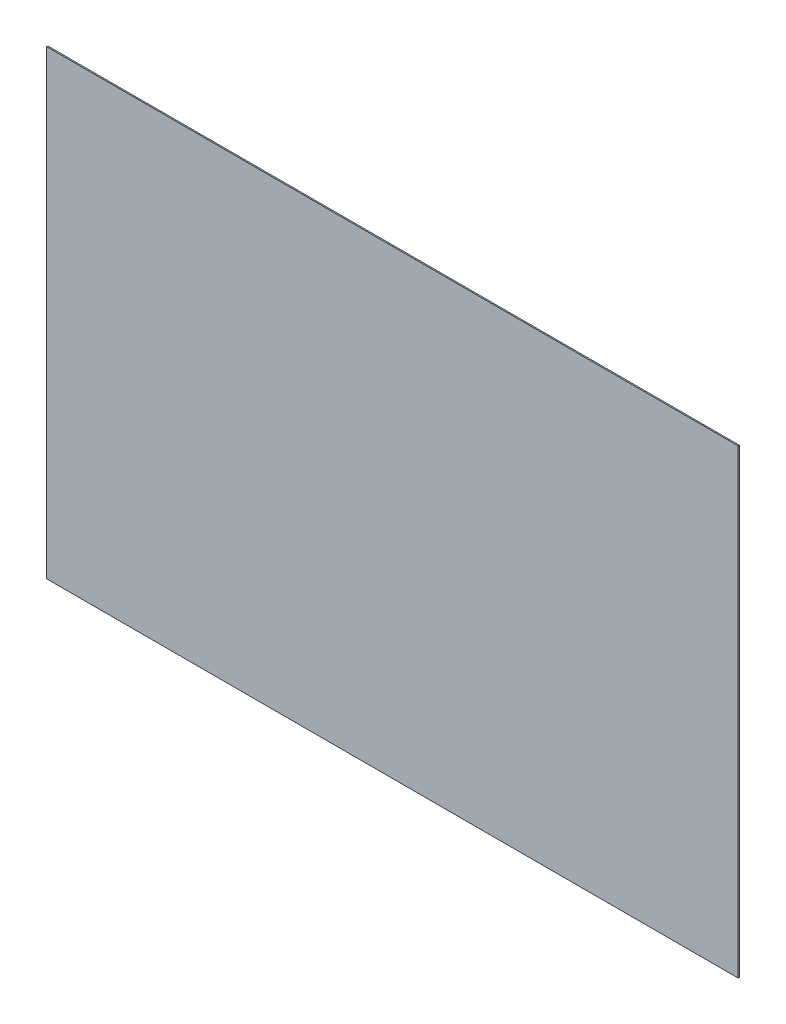
ISO-10303-21;
HEADER;
FILE_DESCRIPTION(('STEP AP214'),'2;1');
FILE_NAME('part.step','',(''),(''),'','','');
FILE_SCHEMA(('AUTOMOTIVE_DESIGN { 1 0 10303 214 1 1 1 1 }'));
ENDSEC;
DATA;
#1=APPLICATION_CONTEXT('core data for automotive mechanical design processes');
#2=APPLICATION_PROTOCOL_DEFINITION('international standard','automotive_design',2000,#1);
#3=PRODUCT_CONTEXT('',#1,'mechanical');
#4=PRODUCT('Part','Part','',(#3));
#5=PRODUCT_RELATED_PRODUCT_CATEGORY('part','',(#4));
#6=PRODUCT_DEFINITION_FORMATION('','',#4);
#7=PRODUCT_DEFINITION_CONTEXT('part definition',#1,'design');
#8=PRODUCT_DEFINITION('design','',#6,#7);
#9=PRODUCT_DEFINITION_SHAPE('','',#8);
#10=(LENGTH_UNIT() NAMED_UNIT(*) SI_UNIT(.MILLI.,.METRE.));
#11=(NAMED_UNIT(*) PLANE_ANGLE_UNIT() SI_UNIT($,.RADIAN.));
#12=(NAMED_UNIT(*) SI_UNIT($,.STERADIAN.) SOLID_ANGLE_UNIT());
#13=UNCERTAINTY_MEASURE_WITH_UNIT(LENGTH_MEASURE(1.E-05),#10,'distance_accuracy_value','');
#14=(GEOMETRIC_REPRESENTATION_CONTEXT(3) GLOBAL_UNCERTAINTY_ASSIGNED_CONTEXT((#13)) GLOBAL_UNIT_ASSIGNED_CONTEXT((#10,
#11,#12)) REPRESENTATION_CONTEXT('',''));
#15=CARTESIAN_POINT('',(0.,0.,0.));
#16=DIRECTION('',(0.,0.,1.));
#17=DIRECTION('',(1.,0.,0.));
#18=AXIS2_PLACEMENT_3D('',#15,#16,#17);
#19=CARTESIAN_POINT('',(-457.2,-304.8,0.79375));
#20=DIRECTION('',(0.,1.,0.));
#21=DIRECTION('',(0.,0.,1.));
#22=AXIS2_PLACEMENT_3D('',#19,#20,#21);
#23=PLANE('',#22);
#24=DIRECTION('',(1.,0.,0.));
#25=VECTOR('',#24,1.);
#26=CARTESIAN_POINT('',(-457.2,-304.8,-0.79375));
#27=LINE('',#26,#25);
#28=CARTESIAN_POINT('',(-457.2,-304.8,-0.79375));
#29=VERTEX_POINT('',#28);
#30=CARTESIAN_POINT('',(457.2,-304.8,-0.79375));
#31=VERTEX_POINT('',#30);
#32=EDGE_CURVE('E95',#29,#31,#27,.T.);
#33=ORIENTED_EDGE('',*,*,#32,.T.);
#34=DIRECTION('',(0.,0.,-1.));
#35=VECTOR('',#34,1.);
#36=CARTESIAN_POINT('',(457.2,-304.8,0.79375));
#37=LINE('',#36,#35);
#38=CARTESIAN_POINT('',(457.2,-304.8,0.79375));
#39=VERTEX_POINT('',#38);
#40=EDGE_CURVE('E11',#39,#31,#37,.T.);
#41=ORIENTED_EDGE('',*,*,#40,.F.);
#42=DIRECTION('',(1.,0.,0.));
#43=VECTOR('',#42,1.);
#44=CARTESIAN_POINT('',(-457.2,-304.8,0.79375));
#45=LINE('',#44,#43);
#46=CARTESIAN_POINT('',(-457.2,-304.8,0.79375));
#47=VERTEX_POINT('',#46);
#48=EDGE_CURVE('E83',#47,#39,#45,.T.);
#49=ORIENTED_EDGE('',*,*,#48,.F.);
#50=DIRECTION('',(0.,0.,-1.));
#51=VECTOR('',#50,1.);
#52=CARTESIAN_POINT('',(-457.2,-304.8,0.79375));
#53=LINE('',#52,#51);
#54=EDGE_CURVE('E91',#47,#29,#53,.T.);
#55=ORIENTED_EDGE('',*,*,#54,.T.);
#56=EDGE_LOOP('',(#33,#41,#49,#55));
#57=FACE_BOUND('',#56,.T.);
#58=ADVANCED_FACE('F32',(#57),#23,.F.);
#59=CARTESIAN_POINT('',(457.2,-304.8,0.79375));
#60=DIRECTION('',(-1.,0.,0.));
#61=DIRECTION('',(0.,0.,1.));
#62=AXIS2_PLACEMENT_3D('',#59,#60,#61);
#63=PLANE('',#62);
#64=DIRECTION('',(0.,1.,0.));
#65=VECTOR('',#64,1.);
#66=CARTESIAN_POINT('',(457.2,-304.8,-0.79375));
#67=LINE('',#66,#65);
#68=CARTESIAN_POINT('',(457.2,304.8,-0.79375));
#69=VERTEX_POINT('',#68);
#70=EDGE_CURVE('E87',#31,#69,#67,.T.);
#71=ORIENTED_EDGE('',*,*,#70,.T.);
#72=DIRECTION('',(0.,0.,-1.));
#73=VECTOR('',#72,1.);
#74=CARTESIAN_POINT('',(457.2,304.8,0.79375));
#75=LINE('',#74,#73);
#76=CARTESIAN_POINT('',(457.2,304.8,0.79375));
#77=VERTEX_POINT('',#76);
#78=EDGE_CURVE('E40',#77,#69,#75,.T.);
#79=ORIENTED_EDGE('',*,*,#78,.F.);
#80=DIRECTION('',(0.,1.,0.));
#81=VECTOR('',#80,1.);
#82=CARTESIAN_POINT('',(457.2,-304.8,0.79375));
#83=LINE('',#82,#81);
#84=EDGE_CURVE('E78',#39,#77,#83,.T.);
#85=ORIENTED_EDGE('',*,*,#84,.F.);
#86=ORIENTED_EDGE('',*,*,#40,.T.);
#87=EDGE_LOOP('',(#71,#79,#85,#86));
#88=FACE_BOUND('',#87,.T.);
#89=ADVANCED_FACE('F86',(#88),#63,.F.);
#90=CARTESIAN_POINT('',(-457.2,304.8,0.79375));
#91=DIRECTION('',(0.,-1.,0.));
#92=DIRECTION('',(0.,0.,-1.));
#93=AXIS2_PLACEMENT_3D('',#90,#91,#92);
#94=PLANE('',#93);
#95=DIRECTION('',(-1.,0.,0.));
#96=VECTOR('',#95,1.);
#97=CARTESIAN_POINT('',(-457.2,304.8,-0.79375));
#98=LINE('',#97,#96);
#99=CARTESIAN_POINT('',(-457.2,304.8,-0.79375));
#100=VERTEX_POINT('',#99);
#101=EDGE_CURVE('E65',#69,#100,#98,.T.);
#102=ORIENTED_EDGE('',*,*,#101,.T.);
#103=DIRECTION('',(0.,0.,-1.));
#104=VECTOR('',#103,1.);
#105=CARTESIAN_POINT('',(-457.2,304.8,0.79375));
#106=LINE('',#105,#104);
#107=CARTESIAN_POINT('',(-457.2,304.8,0.79375));
#108=VERTEX_POINT('',#107);
#109=EDGE_CURVE('E88',#108,#100,#106,.T.);
#110=ORIENTED_EDGE('',*,*,#109,.F.);
#111=DIRECTION('',(-1.,0.,0.));
#112=VECTOR('',#111,1.);
#113=CARTESIAN_POINT('',(-457.2,304.8,0.79375));
#114=LINE('',#113,#112);
#115=EDGE_CURVE('E81',#77,#108,#114,.T.);
#116=ORIENTED_EDGE('',*,*,#115,.F.);
#117=ORIENTED_EDGE('',*,*,#78,.T.);
#118=EDGE_LOOP('',(#102,#110,#116,#117));
#119=FACE_BOUND('',#118,.T.);
#120=ADVANCED_FACE('F89',(#119),#94,.F.);
#121=CARTESIAN_POINT('',(-457.2,-304.8,0.79375));
#122=DIRECTION('',(1.,0.,0.));
#123=DIRECTION('',(0.,0.,-1.));
#124=AXIS2_PLACEMENT_3D('',#121,#122,#123);
#125=PLANE('',#124);
#126=DIRECTION('',(0.,-1.,0.));
#127=VECTOR('',#126,1.);
#128=CARTESIAN_POINT('',(-457.2,-304.8,-0.79375));
#129=LINE('',#128,#127);
#130=EDGE_CURVE('E71',#100,#29,#129,.T.);
#131=ORIENTED_EDGE('',*,*,#130,.T.);
#132=ORIENTED_EDGE('',*,*,#54,.F.);
#133=DIRECTION('',(0.,-1.,0.));
#134=VECTOR('',#133,1.);
#135=CARTESIAN_POINT('',(-457.2,-304.8,0.79375));
#136=LINE('',#135,#134);
#137=EDGE_CURVE('E48',#108,#47,#136,.T.);
#138=ORIENTED_EDGE('',*,*,#137,.F.);
#139=ORIENTED_EDGE('',*,*,#109,.T.);
#140=EDGE_LOOP('',(#131,#132,#138,#139));
#141=FACE_BOUND('',#140,.T.);
#142=ADVANCED_FACE('F102',(#141),#125,.F.);
#143=CARTESIAN_POINT('',(0.,0.,0.79375));
#144=DIRECTION('',(0.,0.,1.));
#145=DIRECTION('',(1.,0.,0.));
#146=AXIS2_PLACEMENT_3D('',#143,#144,#145);
#147=PLANE('',#146);
#148=ORIENTED_EDGE('',*,*,#48,.T.);
#149=ORIENTED_EDGE('',*,*,#84,.T.);
#150=ORIENTED_EDGE('',*,*,#115,.T.);
#151=ORIENTED_EDGE('',*,*,#137,.T.);
#152=EDGE_LOOP('',(#148,#149,#150,#151));
#153=FACE_BOUND('',#152,.T.);
#154=ADVANCED_FACE('F79',(#153),#147,.T.);
#155=CARTESIAN_POINT('',(0.,0.,-0.79375));
#156=DIRECTION('',(0.,0.,1.));
#157=DIRECTION('',(1.,0.,0.));
#158=AXIS2_PLACEMENT_3D('',#155,#156,#157);
#159=PLANE('',#158);
#160=ORIENTED_EDGE('',*,*,#32,.F.);
#161=ORIENTED_EDGE('',*,*,#130,.F.);
#162=ORIENTED_EDGE('',*,*,#101,.F.);
#163=ORIENTED_EDGE('',*,*,#70,.F.);
#164=EDGE_LOOP('',(#160,#161,#162,#163));
#165=FACE_BOUND('',#164,.T.);
#166=ADVANCED_FACE('F105',(#165),#159,.F.);
#167=CLOSED_SHELL('',(#58,#89,#120,#142,#154,#166));
#168=MANIFOLD_SOLID_BREP('B2',#167);
#169=ADVANCED_BREP_SHAPE_REPRESENTATION('',(#18,#168),#14);
#170=SHAPE_DEFINITION_REPRESENTATION(#9,#169);
ENDSEC;
END-ISO-10303-21;
